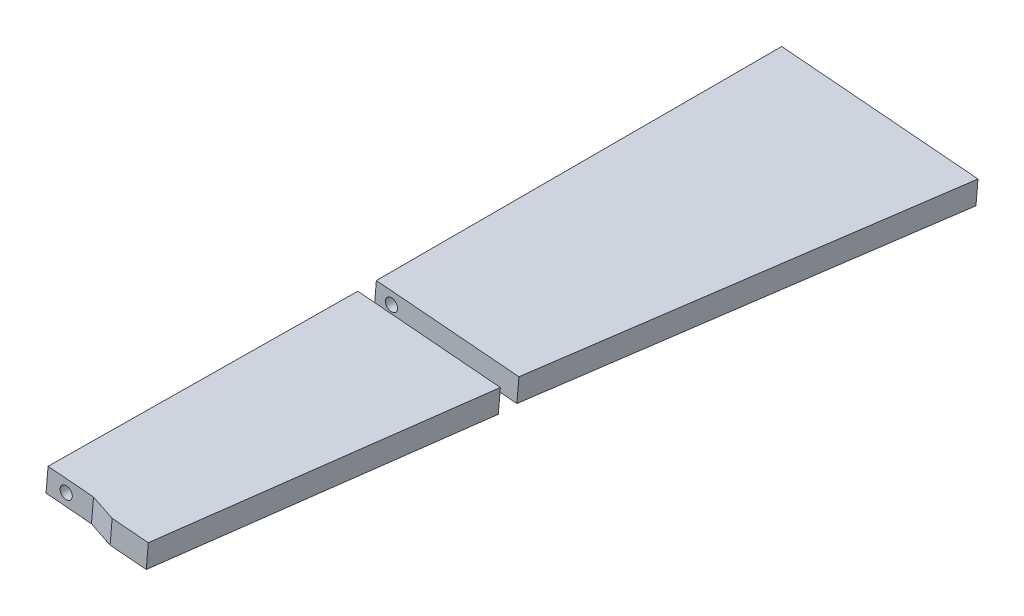
ISO-10303-21;
HEADER;
FILE_DESCRIPTION(('STEP AP214'),'2;1');
FILE_NAME('part.step','',(''),(''),'','','');
FILE_SCHEMA(('AUTOMOTIVE_DESIGN { 1 0 10303 214 1 1 1 1 }'));
ENDSEC;
DATA;
#1=APPLICATION_CONTEXT('core data for automotive mechanical design processes');
#2=APPLICATION_PROTOCOL_DEFINITION('international standard','automotive_design',2000,#1);
#3=PRODUCT_CONTEXT('',#1,'mechanical');
#4=PRODUCT('Part','Part','',(#3));
#5=PRODUCT_RELATED_PRODUCT_CATEGORY('part','',(#4));
#6=PRODUCT_DEFINITION_FORMATION('','',#4);
#7=PRODUCT_DEFINITION_CONTEXT('part definition',#1,'design');
#8=PRODUCT_DEFINITION('design','',#6,#7);
#9=PRODUCT_DEFINITION_SHAPE('','',#8);
#10=(LENGTH_UNIT() NAMED_UNIT(*) SI_UNIT(.MILLI.,.METRE.));
#11=(NAMED_UNIT(*) PLANE_ANGLE_UNIT() SI_UNIT($,.RADIAN.));
#12=(NAMED_UNIT(*) SI_UNIT($,.STERADIAN.) SOLID_ANGLE_UNIT());
#13=UNCERTAINTY_MEASURE_WITH_UNIT(LENGTH_MEASURE(1.E-05),#10,'distance_accuracy_value','');
#14=(GEOMETRIC_REPRESENTATION_CONTEXT(3) GLOBAL_UNCERTAINTY_ASSIGNED_CONTEXT((#13)) GLOBAL_UNIT_ASSIGNED_CONTEXT((#10,
#11,#12)) REPRESENTATION_CONTEXT('',''));
#15=CARTESIAN_POINT('',(0.,0.,0.));
#16=DIRECTION('',(0.,0.,1.));
#17=DIRECTION('',(1.,0.,0.));
#18=AXIS2_PLACEMENT_3D('',#15,#16,#17);
#19=CARTESIAN_POINT('',(6858.55503451942,6093.55504933703,15343.3247766023));
#20=DIRECTION('',(0.,0.,1.));
#21=DIRECTION('',(0.996435306928491,-0.0843604119615637,0.));
#22=AXIS2_PLACEMENT_3D('',#19,#20,#21);
#23=PLANE('',#22);
#24=CARTESIAN_POINT('',(7048.17416210435,5924.55627285052,15343.3247766023));
#25=DIRECTION('',(0.,0.,1.));
#26=DIRECTION('',(0.996435306928491,-0.0843604119615637,0.));
#27=AXIS2_PLACEMENT_3D('',#24,#25,#26);
#28=CIRCLE('',#27,76.2000000000239);
#29=CARTESIAN_POINT('',(7124.10253249232,5918.12800945905,15343.3247766023));
#30=VERTEX_POINT('',#29);
#31=EDGE_CURVE('P0_E162',#30,#30,#28,.T.);
#32=ORIENTED_EDGE('',*,*,#31,.T.);
#33=EDGE_LOOP('',(#32));
#34=FACE_BOUND('',#33,.T.);
#35=DIRECTION('',(-0.996435306928491,0.0843604119615637,0.));
#36=VECTOR('',#35,1.);
#37=CARTESIAN_POINT('',(6832.84198095353,5789.84156778522,15343.3247766023));
#38=LINE('',#37,#36);
#39=CARTESIAN_POINT('',(9290.69096750332,5581.75464874199,15343.3247766022));
#40=VERTEX_POINT('',#39);
#41=CARTESIAN_POINT('',(6832.84198095353,5789.84156778522,15343.3247766023));
#42=VERTEX_POINT('',#41);
#43=EDGE_CURVE('P0_E11',#40,#42,#38,.T.);
#44=ORIENTED_EDGE('',*,*,#43,.T.);
#45=DIRECTION('',(-0.0843604119615637,-0.996435306928491,0.));
#46=VECTOR('',#45,1.);
#47=CARTESIAN_POINT('',(6858.55503451942,6093.55504933703,15343.3247766023));
#48=LINE('',#47,#46);
#49=CARTESIAN_POINT('',(6858.55503451942,6093.55504933703,15343.3247766023));
#50=VERTEX_POINT('',#49);
#51=EDGE_CURVE('P0_E161',#50,#42,#48,.T.);
#52=ORIENTED_EDGE('',*,*,#51,.F.);
#53=DIRECTION('',(-0.996435306928491,0.0843604119615637,0.));
#54=VECTOR('',#53,1.);
#55=CARTESIAN_POINT('',(6858.55503451942,6093.55504933703,15343.3247766023));
#56=LINE('',#55,#54);
#57=CARTESIAN_POINT('',(9316.40402106921,5885.46813029379,15343.3247766022));
#58=VERTEX_POINT('',#57);
#59=EDGE_CURVE('P0_E65',#58,#50,#56,.T.);
#60=ORIENTED_EDGE('',*,*,#59,.F.);
#61=DIRECTION('',(-0.0843604119615637,-0.996435306928491,0.));
#62=VECTOR('',#61,1.);
#63=CARTESIAN_POINT('',(9316.40402106921,5885.46813029379,15343.3247766022));
#64=LINE('',#63,#62);
#65=EDGE_CURVE('P0_E60',#58,#40,#64,.T.);
#66=ORIENTED_EDGE('',*,*,#65,.T.);
#67=EDGE_LOOP('',(#44,#52,#60,#66));
#68=FACE_BOUND('',#67,.T.);
#69=ADVANCED_FACE('P0_F17',(#34,#68),#23,.F.);
#70=CARTESIAN_POINT('',(6858.55503451942,6093.55504933703,15343.3247766023));
#71=DIRECTION('',(0.996435306928491,-0.0843604119615637,0.));
#72=DIRECTION('',(0.,0.,-1.));
#73=AXIS2_PLACEMENT_3D('',#70,#71,#72);
#74=PLANE('',#73);
#75=DIRECTION('',(0.,0.,1.));
#76=VECTOR('',#75,1.);
#77=CARTESIAN_POINT('',(6832.84198095353,5789.84156778522,15343.3247766023));
#78=LINE('',#77,#76);
#79=CARTESIAN_POINT('',(6832.84198095353,5789.84156778523,20419.3932484401));
#80=VERTEX_POINT('',#79);
#81=EDGE_CURVE('P0_E27',#42,#80,#78,.T.);
#82=ORIENTED_EDGE('',*,*,#81,.T.);
#83=DIRECTION('',(-0.0843604119615637,-0.996435306928491,0.));
#84=VECTOR('',#83,1.);
#85=CARTESIAN_POINT('',(6858.55503451942,6093.55504933703,20419.3932484401));
#86=LINE('',#85,#84);
#87=CARTESIAN_POINT('',(6858.55503451942,6093.55504933703,20419.3932484401));
#88=VERTEX_POINT('',#87);
#89=EDGE_CURVE('P0_E151',#88,#80,#86,.T.);
#90=ORIENTED_EDGE('',*,*,#89,.F.);
#91=DIRECTION('',(0.,0.,1.));
#92=VECTOR('',#91,1.);
#93=CARTESIAN_POINT('',(6858.55503451942,6093.55504933703,15343.3247766023));
#94=LINE('',#93,#92);
#95=EDGE_CURVE('P0_E156',#50,#88,#94,.T.);
#96=ORIENTED_EDGE('',*,*,#95,.F.);
#97=ORIENTED_EDGE('',*,*,#51,.T.);
#98=EDGE_LOOP('',(#82,#90,#96,#97));
#99=FACE_BOUND('',#98,.T.);
#100=ADVANCED_FACE('P0_F84',(#99),#74,.F.);
#101=CARTESIAN_POINT('',(8643.79194815199,5942.41295266919,20419.3932484401));
#102=DIRECTION('',(0.,0.,-1.));
#103=DIRECTION('',(-0.996435306928491,0.0843604119615637,0.));
#104=AXIS2_PLACEMENT_3D('',#101,#102,#103);
#105=PLANE('',#104);
#106=CARTESIAN_POINT('',(7048.17416210435,5924.55627285052,20419.3932484401));
#107=DIRECTION('',(0.,0.,-1.));
#108=DIRECTION('',(-0.996435306928491,0.0843604119615637,0.));
#109=AXIS2_PLACEMENT_3D('',#106,#107,#108);
#110=CIRCLE('',#109,76.2000000000239);
#111=CARTESIAN_POINT('',(6972.24579171637,5930.98453624199,20419.3932484401));
#112=VERTEX_POINT('',#111);
#113=EDGE_CURVE('P0_E21',#112,#112,#110,.T.);
#114=ORIENTED_EDGE('',*,*,#113,.T.);
#115=EDGE_LOOP('',(#114));
#116=FACE_BOUND('',#115,.T.);
#117=DIRECTION('',(0.996435306928491,-0.0843604119615637,0.));
#118=VECTOR('',#117,1.);
#119=CARTESIAN_POINT('',(8618.0788945861,5638.69947111739,20419.3932484401));
#120=LINE('',#119,#118);
#121=CARTESIAN_POINT('',(8618.0788945861,5638.69947111739,20419.3932484401));
#122=VERTEX_POINT('',#121);
#123=EDGE_CURVE('P0_E64',#80,#122,#120,.T.);
#124=ORIENTED_EDGE('',*,*,#123,.T.);
#125=DIRECTION('',(-0.0843604119615637,-0.996435306928491,0.));
#126=VECTOR('',#125,1.);
#127=CARTESIAN_POINT('',(8643.79194815199,5942.41295266919,20419.3932484401));
#128=LINE('',#127,#126);
#129=CARTESIAN_POINT('',(8643.79194815199,5942.41295266919,20419.3932484401));
#130=VERTEX_POINT('',#129);
#131=EDGE_CURVE('P0_E63',#130,#122,#128,.T.);
#132=ORIENTED_EDGE('',*,*,#131,.F.);
#133=DIRECTION('',(0.996435306928491,-0.0843604119615637,0.));
#134=VECTOR('',#133,1.);
#135=CARTESIAN_POINT('',(7147.82037340689,6069.06520741245,20419.3932484401));
#136=LINE('',#135,#134);
#137=EDGE_CURVE('P0_E159',#88,#130,#136,.T.);
#138=ORIENTED_EDGE('',*,*,#137,.F.);
#139=ORIENTED_EDGE('',*,*,#89,.T.);
#140=EDGE_LOOP('',(#124,#132,#138,#139));
#141=FACE_BOUND('',#140,.T.);
#142=ADVANCED_FACE('P0_F90',(#116,#141),#105,.F.);
#143=CARTESIAN_POINT('',(9316.40402106921,5885.46813029379,15343.3247766022));
#144=DIRECTION('',(-0.987740069474728,0.0836242539705705,-0.13182010204034));
#145=DIRECTION('',(-0.131350203835911,0.0111203981129393,0.991273655807555));
#146=AXIS2_PLACEMENT_3D('',#143,#144,#145);
#147=PLANE('',#146);
#148=DIRECTION('',(0.131350203835911,-0.0111203981129393,-0.991273655807555));
#149=VECTOR('',#148,1.);
#150=CARTESIAN_POINT('',(9290.69096750332,5581.75464874199,15343.3247766022));
#151=LINE('',#150,#149);
#152=EDGE_CURVE('P0_E56',#122,#40,#151,.T.);
#153=ORIENTED_EDGE('',*,*,#152,.T.);
#154=ORIENTED_EDGE('',*,*,#65,.F.);
#155=DIRECTION('',(0.131350203835911,-0.0111203981129393,-0.991273655807555));
#156=VECTOR('',#155,1.);
#157=CARTESIAN_POINT('',(9316.40402106921,5885.46813029379,15343.3247766022));
#158=LINE('',#157,#156);
#159=EDGE_CURVE('P0_E70',#130,#58,#158,.T.);
#160=ORIENTED_EDGE('',*,*,#159,.F.);
#161=ORIENTED_EDGE('',*,*,#131,.T.);
#162=EDGE_LOOP('',(#153,#154,#160,#161));
#163=FACE_BOUND('',#162,.T.);
#164=ADVANCED_FACE('P0_F58',(#163),#147,.F.);
#165=CARTESIAN_POINT('',(5542.61360282704,6204.9655548891,-6164.21369233085));
#166=DIRECTION('',(-0.0843604119615637,-0.996435306928491,0.));
#167=DIRECTION('',(0.,0.,-1.));
#168=AXIS2_PLACEMENT_3D('',#165,#166,#167);
#169=PLANE('',#168);
#170=ORIENTED_EDGE('',*,*,#59,.T.);
#171=ORIENTED_EDGE('',*,*,#95,.T.);
#172=ORIENTED_EDGE('',*,*,#137,.T.);
#173=ORIENTED_EDGE('',*,*,#159,.T.);
#174=EDGE_LOOP('',(#170,#171,#172,#173));
#175=FACE_BOUND('',#174,.T.);
#176=ADVANCED_FACE('P0_F74',(#175),#169,.F.);
#177=CARTESIAN_POINT('',(5516.90054926115,5901.2520733373,-6164.21369233085));
#178=DIRECTION('',(-0.0843604119615637,-0.996435306928491,0.));
#179=DIRECTION('',(0.,0.,-1.));
#180=AXIS2_PLACEMENT_3D('',#177,#178,#179);
#181=PLANE('',#180);
#182=ORIENTED_EDGE('',*,*,#43,.F.);
#183=ORIENTED_EDGE('',*,*,#152,.F.);
#184=ORIENTED_EDGE('',*,*,#123,.F.);
#185=ORIENTED_EDGE('',*,*,#81,.F.);
#186=EDGE_LOOP('',(#182,#183,#184,#185));
#187=FACE_BOUND('',#186,.T.);
#188=ADVANCED_FACE('P0_F19',(#187),#181,.T.);
#189=CARTESIAN_POINT('',(7048.17416210435,5924.55627285052,24580.3774441407));
#190=DIRECTION('',(0.,0.,-1.));
#191=DIRECTION('',(-1.,0.,0.));
#192=AXIS2_PLACEMENT_3D('',#189,#190,#191);
#193=CYLINDRICAL_SURFACE('',#192,76.2000000000239);
#194=ORIENTED_EDGE('',*,*,#113,.F.);
#195=EDGE_LOOP('',(#194));
#196=FACE_BOUND('',#195,.T.);
#197=ORIENTED_EDGE('',*,*,#31,.F.);
#198=EDGE_LOOP('',(#197));
#199=FACE_BOUND('',#198,.T.);
#200=ADVANCED_FACE('P0_F73',(#196,#199),#193,.F.);
#201=CLOSED_SHELL('',(#69,#100,#142,#164,#176,#188,#200));
#202=MANIFOLD_SOLID_BREP('P0_B1',#201);
#203=CARTESIAN_POINT('',(8643.79194815199,5942.41295266919,20652.0564014297));
#204=DIRECTION('',(0.,0.,1.));
#205=DIRECTION('',(0.996435306928491,-0.0843604119615637,0.));
#206=AXIS2_PLACEMENT_3D('',#203,#204,#205);
#207=PLANE('',#206);
#208=CARTESIAN_POINT('',(7048.17416210435,5924.55627285052,20652.0564014297));
#209=DIRECTION('',(0.,0.,1.));
#210=DIRECTION('',(0.996435306928491,-0.0843604119615637,0.));
#211=AXIS2_PLACEMENT_3D('',#208,#209,#210);
#212=CIRCLE('',#211,76.2000000000239);
#213=CARTESIAN_POINT('',(7124.10253249232,5918.12800945905,20652.0564014297));
#214=VERTEX_POINT('',#213);
#215=EDGE_CURVE('P1_E212',#214,#214,#212,.T.);
#216=ORIENTED_EDGE('',*,*,#215,.T.);
#217=EDGE_LOOP('',(#216));
#218=FACE_BOUND('',#217,.T.);
#219=DIRECTION('',(-0.996435306928491,0.0843604119615637,0.));
#220=VECTOR('',#219,1.);
#221=CARTESIAN_POINT('',(8618.0788945861,5638.69947111739,20652.0564014297));
#222=LINE('',#221,#220);
#223=CARTESIAN_POINT('',(8618.0788945861,5638.69947111739,20652.0564014297));
#224=VERTEX_POINT('',#223);
#225=CARTESIAN_POINT('',(6832.84198095353,5789.84156778523,20652.0564014297));
#226=VERTEX_POINT('',#225);
#227=EDGE_CURVE('P1_E11',#224,#226,#222,.T.);
#228=ORIENTED_EDGE('',*,*,#227,.T.);
#229=DIRECTION('',(-0.0843604119615637,-0.996435306928491,0.));
#230=VECTOR('',#229,1.);
#231=CARTESIAN_POINT('',(6858.55503451942,6093.55504933703,20652.0564014297));
#232=LINE('',#231,#230);
#233=CARTESIAN_POINT('',(6858.55503451942,6093.55504933703,20652.0564014297));
#234=VERTEX_POINT('',#233);
#235=EDGE_CURVE('P1_E209',#234,#226,#232,.T.);
#236=ORIENTED_EDGE('',*,*,#235,.F.);
#237=DIRECTION('',(-0.996435306928491,0.0843604119615637,0.));
#238=VECTOR('',#237,1.);
#239=CARTESIAN_POINT('',(8643.79194815199,5942.41295266919,20652.0564014297));
#240=LINE('',#239,#238);
#241=CARTESIAN_POINT('',(8643.79194815199,5942.41295266919,20652.0564014297));
#242=VERTEX_POINT('',#241);
#243=EDGE_CURVE('P1_E78',#242,#234,#240,.T.);
#244=ORIENTED_EDGE('',*,*,#243,.F.);
#245=DIRECTION('',(-0.0843604119615637,-0.996435306928491,0.));
#246=VECTOR('',#245,1.);
#247=CARTESIAN_POINT('',(8643.79194815199,5942.41295266919,20652.0564014297));
#248=LINE('',#247,#246);
#249=EDGE_CURVE('P1_E72',#242,#224,#248,.T.);
#250=ORIENTED_EDGE('',*,*,#249,.T.);
#251=EDGE_LOOP('',(#228,#236,#244,#250));
#252=FACE_BOUND('',#251,.T.);
#253=ADVANCED_FACE('P1_F17',(#218,#252),#207,.F.);
#254=CARTESIAN_POINT('',(6858.55503451942,6093.55504933703,20652.0564014297));
#255=DIRECTION('',(0.996387048534786,-0.0843563262994588,0.00984173386136541));
#256=DIRECTION('',(0.00980665110085809,-0.000830252722961683,-0.999951568964519));
#257=AXIS2_PLACEMENT_3D('',#254,#255,#256);
#258=PLANE('',#257);
#259=DIRECTION('',(-0.00980665110085808,0.000830252722961682,0.999951568964518));
#260=VECTOR('',#259,1.);
#261=CARTESIAN_POINT('',(6832.84198095353,5789.84156778523,20652.0564014297));
#262=LINE('',#261,#260);
#263=CARTESIAN_POINT('',(6795.17288346866,5793.03071670433,24493.0488813372));
#264=VERTEX_POINT('',#263);
#265=EDGE_CURVE('P1_E27',#226,#264,#262,.T.);
#266=ORIENTED_EDGE('',*,*,#265,.T.);
#267=DIRECTION('',(-0.0843604119615637,-0.996435306928491,0.));
#268=VECTOR('',#267,1.);
#269=CARTESIAN_POINT('',(6820.88593703455,6096.74419825613,24493.0488813372));
#270=LINE('',#269,#268);
#271=CARTESIAN_POINT('',(6820.88593703455,6096.74419825613,24493.0488813372));
#272=VERTEX_POINT('',#271);
#273=EDGE_CURVE('P1_E200',#272,#264,#270,.T.);
#274=ORIENTED_EDGE('',*,*,#273,.F.);
#275=DIRECTION('',(-0.00980665110085808,0.000830252722961682,0.999951568964518));
#276=VECTOR('',#275,1.);
#277=CARTESIAN_POINT('',(6858.55503451942,6093.55504933703,20652.0564014297));
#278=LINE('',#277,#276);
#279=EDGE_CURVE('P1_E203',#234,#272,#278,.T.);
#280=ORIENTED_EDGE('',*,*,#279,.F.);
#281=ORIENTED_EDGE('',*,*,#235,.T.);
#282=EDGE_LOOP('',(#266,#274,#280,#281));
#283=FACE_BOUND('',#282,.T.);
#284=ADVANCED_FACE('P1_F97',(#283),#258,.F.);
#285=CARTESIAN_POINT('',(6820.88593703455,6096.74419825613,24493.0488813372));
#286=DIRECTION('',(0.,0.,-1.));
#287=DIRECTION('',(-0.996435306928491,0.0843604119615637,0.));
#288=AXIS2_PLACEMENT_3D('',#285,#286,#287);
#289=PLANE('',#288);
#290=CARTESIAN_POINT('',(7048.17416210435,5924.55627285052,24493.0488813372));
#291=DIRECTION('',(0.,0.,-1.));
#292=DIRECTION('',(-0.996435306928491,0.0843604119615637,0.));
#293=AXIS2_PLACEMENT_3D('',#290,#291,#292);
#294=CIRCLE('',#293,76.2000000000239);
#295=CARTESIAN_POINT('',(6972.24579171637,5930.98453624199,24493.0488813372));
#296=VERTEX_POINT('',#295);
#297=EDGE_CURVE('P1_E21',#296,#296,#294,.T.);
#298=ORIENTED_EDGE('',*,*,#297,.T.);
#299=EDGE_LOOP('',(#298));
#300=FACE_BOUND('',#299,.T.);
#301=DIRECTION('',(0.996435306928491,-0.0843604119615637,0.));
#302=VECTOR('',#301,1.);
#303=CARTESIAN_POINT('',(6795.17288346866,5793.03071670433,24493.0488813372));
#304=LINE('',#303,#302);
#305=CARTESIAN_POINT('',(7364.48383591187,5744.83159514732,24493.0488813372));
#306=VERTEX_POINT('',#305);
#307=EDGE_CURVE('P1_E185',#264,#306,#304,.T.);
#308=ORIENTED_EDGE('',*,*,#307,.T.);
#309=DIRECTION('',(-0.0843604119615637,-0.996435306928491,0.));
#310=VECTOR('',#309,1.);
#311=CARTESIAN_POINT('',(7390.19688947776,6048.54507669913,24493.0488813372));
#312=LINE('',#311,#310);
#313=CARTESIAN_POINT('',(7390.19688947776,6048.54507669913,24493.0488813372));
#314=VERTEX_POINT('',#313);
#315=EDGE_CURVE('P1_E199',#314,#306,#312,.T.);
#316=ORIENTED_EDGE('',*,*,#315,.F.);
#317=DIRECTION('',(0.996435306928491,-0.0843604119615637,0.));
#318=VECTOR('',#317,1.);
#319=CARTESIAN_POINT('',(6820.88593703455,6096.74419825613,24493.0488813372));
#320=LINE('',#319,#318);
#321=EDGE_CURVE('P1_E196',#272,#314,#320,.T.);
#322=ORIENTED_EDGE('',*,*,#321,.F.);
#323=ORIENTED_EDGE('',*,*,#273,.T.);
#324=EDGE_LOOP('',(#308,#316,#322,#323));
#325=FACE_BOUND('',#324,.T.);
#326=ADVANCED_FACE('P1_F103',(#300,#325),#289,.F.);
#327=CARTESIAN_POINT('',(7390.19688947776,6048.54507669913,24493.0488813372));
#328=DIRECTION('',(0.260981279866857,-0.0220952510722354,-0.965090965370163));
#329=DIRECTION('',(-0.961650712292531,0.0814154714190099,-0.26191492618957));
#330=AXIS2_PLACEMENT_3D('',#327,#328,#329);
#331=PLANE('',#330);
#332=DIRECTION('',(0.961650712292531,-0.0814154714190099,0.26191492618957));
#333=VECTOR('',#332,1.);
#334=CARTESIAN_POINT('',(7364.48383591187,5744.83159514732,24493.0488813372));
#335=LINE('',#334,#333);
#336=CARTESIAN_POINT('',(7685.12067721439,5717.68577259943,24580.3774441407));
#337=VERTEX_POINT('',#336);
#338=EDGE_CURVE('P1_E183',#306,#337,#335,.T.);
#339=ORIENTED_EDGE('',*,*,#338,.T.);
#340=DIRECTION('',(-0.0843604119615637,-0.996435306928491,0.));
#341=VECTOR('',#340,1.);
#342=CARTESIAN_POINT('',(7710.83373078028,6021.39925415124,24580.3774441407));
#343=LINE('',#342,#341);
#344=CARTESIAN_POINT('',(7710.83373078028,6021.39925415124,24580.3774441407));
#345=VERTEX_POINT('',#344);
#346=EDGE_CURVE('P1_E181',#345,#337,#343,.T.);
#347=ORIENTED_EDGE('',*,*,#346,.F.);
#348=DIRECTION('',(0.961650712292531,-0.0814154714190099,0.26191492618957));
#349=VECTOR('',#348,1.);
#350=CARTESIAN_POINT('',(7390.19688947776,6048.54507669913,24493.0488813372));
#351=LINE('',#350,#349);
#352=EDGE_CURVE('P1_E189',#314,#345,#351,.T.);
#353=ORIENTED_EDGE('',*,*,#352,.F.);
#354=ORIENTED_EDGE('',*,*,#315,.T.);
#355=EDGE_LOOP('',(#339,#347,#353,#354));
#356=FACE_BOUND('',#355,.T.);
#357=ADVANCED_FACE('P1_F110',(#356),#331,.F.);
#358=CARTESIAN_POINT('',(7710.83373078028,6021.39925415124,24580.3774441407));
#359=DIRECTION('',(0.,0.,-1.));
#360=DIRECTION('',(-0.996435306928491,0.0843604119615637,0.));
#361=AXIS2_PLACEMENT_3D('',#358,#359,#360);
#362=PLANE('',#361);
#363=DIRECTION('',(0.996435306928491,-0.0843604119615637,0.));
#364=VECTOR('',#363,1.);
#365=CARTESIAN_POINT('',(7685.12067721439,5717.68577259943,24580.3774441407));
#366=LINE('',#365,#364);
#367=CARTESIAN_POINT('',(8137.88279203103,5679.35393282926,24580.3774441407));
#368=VERTEX_POINT('',#367);
#369=EDGE_CURVE('P1_E77',#337,#368,#366,.T.);
#370=ORIENTED_EDGE('',*,*,#369,.T.);
#371=DIRECTION('',(-0.0843604119615637,-0.996435306928491,0.));
#372=VECTOR('',#371,1.);
#373=CARTESIAN_POINT('',(8163.59584559692,5983.06741438107,24580.3774441407));
#374=LINE('',#373,#372);
#375=CARTESIAN_POINT('',(8163.59584559692,5983.06741438107,24580.3774441407));
#376=VERTEX_POINT('',#375);
#377=EDGE_CURVE('P1_E75',#376,#368,#374,.T.);
#378=ORIENTED_EDGE('',*,*,#377,.F.);
#379=DIRECTION('',(0.996435306928491,-0.0843604119615637,0.));
#380=VECTOR('',#379,1.);
#381=CARTESIAN_POINT('',(7710.83373078028,6021.39925415124,24580.3774441407));
#382=LINE('',#381,#380);
#383=EDGE_CURVE('P1_E192',#345,#376,#382,.T.);
#384=ORIENTED_EDGE('',*,*,#383,.F.);
#385=ORIENTED_EDGE('',*,*,#346,.T.);
#386=EDGE_LOOP('',(#370,#378,#384,#385));
#387=FACE_BOUND('',#386,.T.);
#388=ADVANCED_FACE('P1_F114',(#387),#362,.F.);
#389=CARTESIAN_POINT('',(8163.59584559692,5983.06741438107,24580.3774441407));
#390=DIRECTION('',(-0.989020911683189,0.0837326928984289,-0.12176400286345));
#391=DIRECTION('',(-0.121329951566084,0.0102720614436505,0.992559080159297));
#392=AXIS2_PLACEMENT_3D('',#389,#390,#391);
#393=PLANE('',#392);
#394=DIRECTION('',(0.121329951566084,-0.0102720614436505,-0.992559080159297));
#395=VECTOR('',#394,1.);
#396=CARTESIAN_POINT('',(8137.88279203103,5679.35393282926,24580.3774441407));
#397=LINE('',#396,#395);
#398=EDGE_CURVE('P1_E68',#368,#224,#397,.T.);
#399=ORIENTED_EDGE('',*,*,#398,.T.);
#400=ORIENTED_EDGE('',*,*,#249,.F.);
#401=DIRECTION('',(0.121329951566084,-0.0102720614436505,-0.992559080159297));
#402=VECTOR('',#401,1.);
#403=CARTESIAN_POINT('',(8163.59584559692,5983.06741438107,24580.3774441407));
#404=LINE('',#403,#402);
#405=EDGE_CURVE('P1_E83',#376,#242,#404,.T.);
#406=ORIENTED_EDGE('',*,*,#405,.F.);
#407=ORIENTED_EDGE('',*,*,#377,.T.);
#408=EDGE_LOOP('',(#399,#400,#406,#407));
#409=FACE_BOUND('',#408,.T.);
#410=ADVANCED_FACE('P1_F70',(#409),#393,.F.);
#411=CARTESIAN_POINT('',(5542.61360282704,6204.9655548891,-6164.21369233085));
#412=DIRECTION('',(0.0843604119615637,0.996435306928491,0.));
#413=DIRECTION('',(0.,0.,1.));
#414=AXIS2_PLACEMENT_3D('',#411,#412,#413);
#415=PLANE('',#414);
#416=ORIENTED_EDGE('',*,*,#243,.T.);
#417=ORIENTED_EDGE('',*,*,#279,.T.);
#418=ORIENTED_EDGE('',*,*,#321,.T.);
#419=ORIENTED_EDGE('',*,*,#352,.T.);
#420=ORIENTED_EDGE('',*,*,#383,.T.);
#421=ORIENTED_EDGE('',*,*,#405,.T.);
#422=EDGE_LOOP('',(#416,#417,#418,#419,#420,#421));
#423=FACE_BOUND('',#422,.T.);
#424=ADVANCED_FACE('P1_F87',(#423),#415,.T.);
#425=CARTESIAN_POINT('',(5516.90054926115,5901.2520733373,-6164.21369233085));
#426=DIRECTION('',(0.0843604119615637,0.996435306928491,0.));
#427=DIRECTION('',(0.,0.,1.));
#428=AXIS2_PLACEMENT_3D('',#425,#426,#427);
#429=PLANE('',#428);
#430=ORIENTED_EDGE('',*,*,#227,.F.);
#431=ORIENTED_EDGE('',*,*,#398,.F.);
#432=ORIENTED_EDGE('',*,*,#369,.F.);
#433=ORIENTED_EDGE('',*,*,#338,.F.);
#434=ORIENTED_EDGE('',*,*,#307,.F.);
#435=ORIENTED_EDGE('',*,*,#265,.F.);
#436=EDGE_LOOP('',(#430,#431,#432,#433,#434,#435));
#437=FACE_BOUND('',#436,.T.);
#438=ADVANCED_FACE('P1_F19',(#437),#429,.F.);
#439=CARTESIAN_POINT('',(7048.17416210435,5924.55627285052,24580.3774441407));
#440=DIRECTION('',(0.,0.,-1.));
#441=DIRECTION('',(-1.,0.,0.));
#442=AXIS2_PLACEMENT_3D('',#439,#440,#441);
#443=CYLINDRICAL_SURFACE('',#442,76.2000000000239);
#444=ORIENTED_EDGE('',*,*,#297,.F.);
#445=EDGE_LOOP('',(#444));
#446=FACE_BOUND('',#445,.T.);
#447=ORIENTED_EDGE('',*,*,#215,.F.);
#448=EDGE_LOOP('',(#447));
#449=FACE_BOUND('',#448,.T.);
#450=ADVANCED_FACE('P1_F86',(#446,#449),#443,.F.);
#451=CLOSED_SHELL('',(#253,#284,#326,#357,#388,#410,#424,#438,#450));
#452=MANIFOLD_SOLID_BREP('P1_B1',#451);
#453=ADVANCED_BREP_SHAPE_REPRESENTATION('',(#18,#202,#452),#14);
#454=SHAPE_DEFINITION_REPRESENTATION(#9,#453);
ENDSEC;
END-ISO-10303-21;
